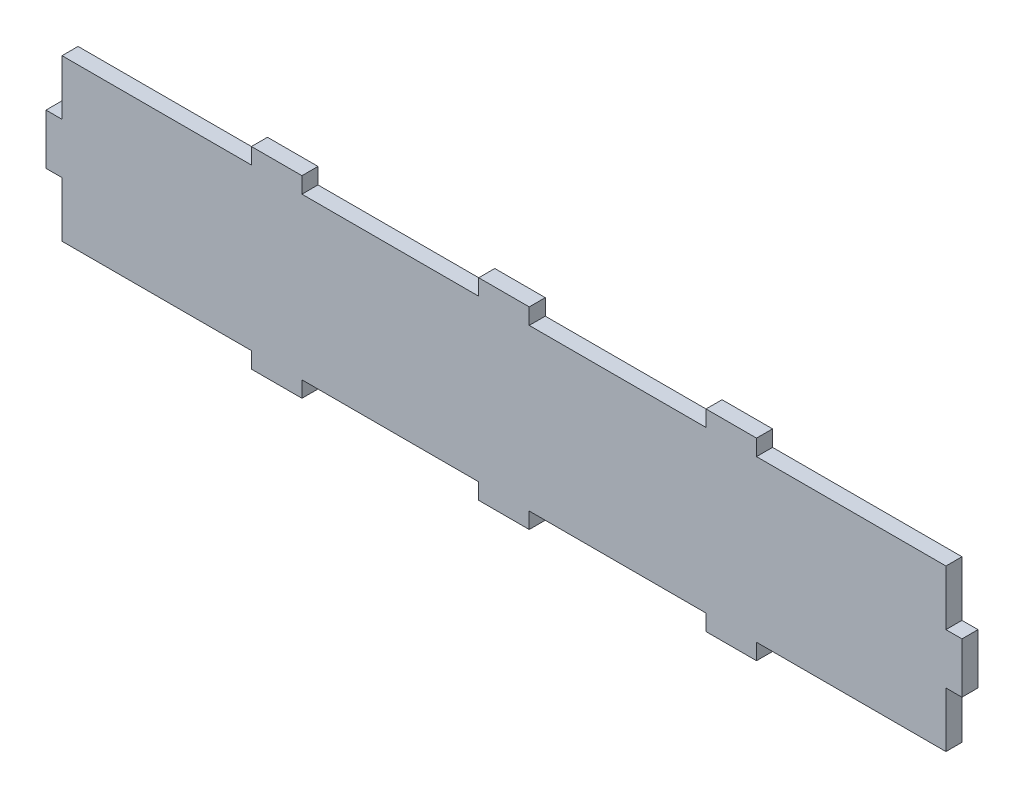
ISO-10303-21;
HEADER;
FILE_DESCRIPTION(('STEP AP214'),'2;1');
FILE_NAME('part.step','',(''),(''),'','','');
FILE_SCHEMA(('AUTOMOTIVE_DESIGN { 1 0 10303 214 1 1 1 1 }'));
ENDSEC;
DATA;
#1=APPLICATION_CONTEXT('core data for automotive mechanical design processes');
#2=APPLICATION_PROTOCOL_DEFINITION('international standard','automotive_design',2000,#1);
#3=PRODUCT_CONTEXT('',#1,'mechanical');
#4=PRODUCT('Part','Part','',(#3));
#5=PRODUCT_RELATED_PRODUCT_CATEGORY('part','',(#4));
#6=PRODUCT_DEFINITION_FORMATION('','',#4);
#7=PRODUCT_DEFINITION_CONTEXT('part definition',#1,'design');
#8=PRODUCT_DEFINITION('design','',#6,#7);
#9=PRODUCT_DEFINITION_SHAPE('','',#8);
#10=(LENGTH_UNIT() NAMED_UNIT(*) SI_UNIT(.MILLI.,.METRE.));
#11=(NAMED_UNIT(*) PLANE_ANGLE_UNIT() SI_UNIT($,.RADIAN.));
#12=(NAMED_UNIT(*) SI_UNIT($,.STERADIAN.) SOLID_ANGLE_UNIT());
#13=UNCERTAINTY_MEASURE_WITH_UNIT(LENGTH_MEASURE(1.E-05),#10,'distance_accuracy_value','');
#14=(GEOMETRIC_REPRESENTATION_CONTEXT(3) GLOBAL_UNCERTAINTY_ASSIGNED_CONTEXT((#13)) GLOBAL_UNIT_ASSIGNED_CONTEXT((#10,
#11,#12)) REPRESENTATION_CONTEXT('',''));
#15=CARTESIAN_POINT('',(0.,0.,0.));
#16=DIRECTION('',(0.,0.,1.));
#17=DIRECTION('',(1.,0.,0.));
#18=AXIS2_PLACEMENT_3D('',#15,#16,#17);
#19=CARTESIAN_POINT('',(193.650000026,6.34999999999999,6.35));
#20=DIRECTION('',(0.,1.,0.));
#21=DIRECTION('',(-1.,0.,0.));
#22=AXIS2_PLACEMENT_3D('',#19,#20,#21);
#23=PLANE('',#22);
#24=DIRECTION('',(1.,0.,0.));
#25=VECTOR('',#24,1.);
#26=CARTESIAN_POINT('',(193.650000026,6.34999999999999,6.35));
#27=LINE('',#26,#25);
#28=CARTESIAN_POINT('',(-61.349999974,6.35,6.35));
#29=VERTEX_POINT('',#28);
#30=CARTESIAN_POINT('',(8.65000002599997,6.35,6.35));
#31=VERTEX_POINT('',#30);
#32=EDGE_CURVE('E48',#29,#31,#27,.T.);
#33=ORIENTED_EDGE('',*,*,#32,.F.);
#34=DIRECTION('',(0.,0.,-1.));
#35=VECTOR('',#34,1.);
#36=CARTESIAN_POINT('',(-61.349999974,6.34999999999999,6.52347253575138E-13));
#37=LINE('',#36,#35);
#38=CARTESIAN_POINT('',(-61.349999974,6.34999999999999,6.52347253575138E-13));
#39=VERTEX_POINT('',#38);
#40=EDGE_CURVE('E274',#29,#39,#37,.T.);
#41=ORIENTED_EDGE('',*,*,#40,.T.);
#42=DIRECTION('',(1.,0.,0.));
#43=VECTOR('',#42,1.);
#44=CARTESIAN_POINT('',(193.650000026,6.34999999999999,0.));
#45=LINE('',#44,#43);
#46=CARTESIAN_POINT('',(8.65000002599998,6.34999999999999,0.));
#47=VERTEX_POINT('',#46);
#48=EDGE_CURVE('E527',#39,#47,#45,.T.);
#49=ORIENTED_EDGE('',*,*,#48,.T.);
#50=DIRECTION('',(0.,0.,1.));
#51=VECTOR('',#50,1.);
#52=CARTESIAN_POINT('',(8.65000002599998,6.34999999999999,0.));
#53=LINE('',#52,#51);
#54=EDGE_CURVE('E338',#47,#31,#53,.T.);
#55=ORIENTED_EDGE('',*,*,#54,.T.);
#56=EDGE_LOOP('',(#33,#41,#49,#55));
#57=FACE_BOUND('',#56,.T.);
#58=ADVANCED_FACE('F33',(#57),#23,.F.);
#59=CARTESIAN_POINT('',(118.650000026,6.35,6.35));
#60=VERTEX_POINT('',#59);
#61=CARTESIAN_POINT('',(193.650000026,6.34999999999999,6.35));
#62=VERTEX_POINT('',#61);
#63=EDGE_CURVE('E508',#60,#62,#27,.T.);
#64=ORIENTED_EDGE('',*,*,#63,.F.);
#65=DIRECTION('',(0.,0.,-1.));
#66=VECTOR('',#65,1.);
#67=CARTESIAN_POINT('',(118.650000026,6.34999999999999,0.));
#68=LINE('',#67,#66);
#69=CARTESIAN_POINT('',(118.650000026,6.34999999999999,0.));
#70=VERTEX_POINT('',#69);
#71=EDGE_CURVE('E277',#60,#70,#68,.T.);
#72=ORIENTED_EDGE('',*,*,#71,.T.);
#73=CARTESIAN_POINT('',(193.650000026,6.34999999999999,0.));
#74=VERTEX_POINT('',#73);
#75=EDGE_CURVE('E524',#70,#74,#45,.T.);
#76=ORIENTED_EDGE('',*,*,#75,.T.);
#77=DIRECTION('',(0.,0.,-1.));
#78=VECTOR('',#77,1.);
#79=CARTESIAN_POINT('',(193.650000026,6.34999999999999,6.35));
#80=LINE('',#79,#78);
#81=EDGE_CURVE('E511',#62,#74,#80,.T.);
#82=ORIENTED_EDGE('',*,*,#81,.F.);
#83=EDGE_LOOP('',(#64,#72,#76,#82));
#84=FACE_BOUND('',#83,.T.);
#85=ADVANCED_FACE('F601',(#84),#23,.F.);
#86=CARTESIAN_POINT('',(28.650000026,6.34999999999999,0.));
#87=VERTEX_POINT('',#86);
#88=CARTESIAN_POINT('',(98.650000026,6.35,0.));
#89=VERTEX_POINT('',#88);
#90=EDGE_CURVE('E528',#87,#89,#45,.T.);
#91=ORIENTED_EDGE('',*,*,#90,.T.);
#92=DIRECTION('',(0.,0.,1.));
#93=VECTOR('',#92,1.);
#94=CARTESIAN_POINT('',(98.650000026,6.34999999999999,0.));
#95=LINE('',#94,#93);
#96=CARTESIAN_POINT('',(98.650000026,6.35,6.35));
#97=VERTEX_POINT('',#96);
#98=EDGE_CURVE('E309',#89,#97,#95,.T.);
#99=ORIENTED_EDGE('',*,*,#98,.T.);
#100=CARTESIAN_POINT('',(28.650000026,6.34999999999999,6.34999999999999));
#101=VERTEX_POINT('',#100);
#102=EDGE_CURVE('E512',#101,#97,#27,.T.);
#103=ORIENTED_EDGE('',*,*,#102,.F.);
#104=DIRECTION('',(0.,0.,-1.));
#105=VECTOR('',#104,1.);
#106=CARTESIAN_POINT('',(28.650000026,6.34999999999999,0.));
#107=LINE('',#106,#105);
#108=EDGE_CURVE('E333',#101,#87,#107,.T.);
#109=ORIENTED_EDGE('',*,*,#108,.T.);
#110=EDGE_LOOP('',(#91,#99,#103,#109));
#111=FACE_BOUND('',#110,.T.);
#112=ADVANCED_FACE('F607',(#111),#23,.F.);
#113=CARTESIAN_POINT('',(193.650000026,70.,6.35));
#114=DIRECTION('',(0.,-1.,0.));
#115=DIRECTION('',(0.,0.,-1.));
#116=AXIS2_PLACEMENT_3D('',#113,#114,#115);
#117=PLANE('',#116);
#118=DIRECTION('',(0.,0.,-1.));
#119=VECTOR('',#118,1.);
#120=CARTESIAN_POINT('',(-61.349999974,70.,6.52347253575138E-13));
#121=LINE('',#120,#119);
#122=CARTESIAN_POINT('',(-61.349999974,70.,6.35));
#123=VERTEX_POINT('',#122);
#124=CARTESIAN_POINT('',(-61.349999974,70.,0.));
#125=VERTEX_POINT('',#124);
#126=EDGE_CURVE('E360',#123,#125,#121,.T.);
#127=ORIENTED_EDGE('',*,*,#126,.F.);
#128=DIRECTION('',(-1.,0.,0.));
#129=VECTOR('',#128,1.);
#130=CARTESIAN_POINT('',(193.650000026,70.,6.35));
#131=LINE('',#130,#129);
#132=CARTESIAN_POINT('',(8.65000002599998,70.,6.35));
#133=VERTEX_POINT('',#132);
#134=EDGE_CURVE('E504',#133,#123,#131,.T.);
#135=ORIENTED_EDGE('',*,*,#134,.F.);
#136=DIRECTION('',(0.,0.,1.));
#137=VECTOR('',#136,1.);
#138=CARTESIAN_POINT('',(8.65000002599998,70.,0.));
#139=LINE('',#138,#137);
#140=CARTESIAN_POINT('',(8.65000002599997,70.,0.));
#141=VERTEX_POINT('',#140);
#142=EDGE_CURVE('E419',#141,#133,#139,.T.);
#143=ORIENTED_EDGE('',*,*,#142,.F.);
#144=DIRECTION('',(-1.,0.,0.));
#145=VECTOR('',#144,1.);
#146=CARTESIAN_POINT('',(193.650000026,70.,0.));
#147=LINE('',#146,#145);
#148=EDGE_CURVE('E521',#141,#125,#147,.T.);
#149=ORIENTED_EDGE('',*,*,#148,.T.);
#150=EDGE_LOOP('',(#127,#135,#143,#149));
#151=FACE_BOUND('',#150,.T.);
#152=ADVANCED_FACE('F578',(#151),#117,.F.);
#153=DIRECTION('',(0.,0.,1.));
#154=VECTOR('',#153,1.);
#155=CARTESIAN_POINT('',(-81.349999974,70.,6.59695134370022E-13));
#156=LINE('',#155,#154);
#157=CARTESIAN_POINT('',(-81.349999974,70.,6.59695134370022E-13));
#158=VERTEX_POINT('',#157);
#159=CARTESIAN_POINT('',(-81.349999974,70.,6.35));
#160=VERTEX_POINT('',#159);
#161=EDGE_CURVE('E365',#158,#160,#156,.T.);
#162=ORIENTED_EDGE('',*,*,#161,.F.);
#163=CARTESIAN_POINT('',(-156.349999974,70.,0.));
#164=VERTEX_POINT('',#163);
#165=EDGE_CURVE('E516',#158,#164,#147,.T.);
#166=ORIENTED_EDGE('',*,*,#165,.T.);
#167=DIRECTION('',(0.,0.,-1.));
#168=VECTOR('',#167,1.);
#169=CARTESIAN_POINT('',(-156.349999974,70.,6.35));
#170=LINE('',#169,#168);
#171=CARTESIAN_POINT('',(-156.349999974,70.,6.35));
#172=VERTEX_POINT('',#171);
#173=EDGE_CURVE('E41',#172,#164,#170,.T.);
#174=ORIENTED_EDGE('',*,*,#173,.F.);
#175=EDGE_CURVE('E497',#160,#172,#131,.T.);
#176=ORIENTED_EDGE('',*,*,#175,.F.);
#177=EDGE_LOOP('',(#162,#166,#174,#176));
#178=FACE_BOUND('',#177,.T.);
#179=ADVANCED_FACE('F580',(#178),#117,.F.);
#180=DIRECTION('',(0.,0.,-1.));
#181=VECTOR('',#180,1.);
#182=CARTESIAN_POINT('',(118.650000026,70.,0.));
#183=LINE('',#182,#181);
#184=CARTESIAN_POINT('',(118.650000026,70.,6.35));
#185=VERTEX_POINT('',#184);
#186=CARTESIAN_POINT('',(118.650000026,70.,0.));
#187=VERTEX_POINT('',#186);
#188=EDGE_CURVE('E387',#185,#187,#183,.T.);
#189=ORIENTED_EDGE('',*,*,#188,.F.);
#190=CARTESIAN_POINT('',(193.650000026,70.,6.35));
#191=VERTEX_POINT('',#190);
#192=EDGE_CURVE('E499',#191,#185,#131,.T.);
#193=ORIENTED_EDGE('',*,*,#192,.F.);
#194=DIRECTION('',(0.,0.,-1.));
#195=VECTOR('',#194,1.);
#196=CARTESIAN_POINT('',(193.650000026,70.,6.35));
#197=LINE('',#196,#195);
#198=CARTESIAN_POINT('',(193.650000026,70.,0.));
#199=VERTEX_POINT('',#198);
#200=EDGE_CURVE('E11',#191,#199,#197,.T.);
#201=ORIENTED_EDGE('',*,*,#200,.T.);
#202=EDGE_CURVE('E517',#199,#187,#147,.T.);
#203=ORIENTED_EDGE('',*,*,#202,.T.);
#204=EDGE_LOOP('',(#189,#193,#201,#203));
#205=FACE_BOUND('',#204,.T.);
#206=ADVANCED_FACE('F625',(#205),#117,.F.);
#207=DIRECTION('',(0.,0.,1.));
#208=VECTOR('',#207,1.);
#209=CARTESIAN_POINT('',(98.650000026,70.,0.));
#210=LINE('',#209,#208);
#211=CARTESIAN_POINT('',(98.650000026,70.,0.));
#212=VERTEX_POINT('',#211);
#213=CARTESIAN_POINT('',(98.650000026,70.,6.35));
#214=VERTEX_POINT('',#213);
#215=EDGE_CURVE('E392',#212,#214,#210,.T.);
#216=ORIENTED_EDGE('',*,*,#215,.F.);
#217=CARTESIAN_POINT('',(28.650000026,70.,0.));
#218=VERTEX_POINT('',#217);
#219=EDGE_CURVE('E520',#212,#218,#147,.T.);
#220=ORIENTED_EDGE('',*,*,#219,.T.);
#221=DIRECTION('',(0.,0.,-1.));
#222=VECTOR('',#221,1.);
#223=CARTESIAN_POINT('',(28.650000026,70.,0.));
#224=LINE('',#223,#222);
#225=CARTESIAN_POINT('',(28.650000026,70.,6.35));
#226=VERTEX_POINT('',#225);
#227=EDGE_CURVE('E414',#226,#218,#224,.T.);
#228=ORIENTED_EDGE('',*,*,#227,.F.);
#229=EDGE_CURVE('E503',#214,#226,#131,.T.);
#230=ORIENTED_EDGE('',*,*,#229,.F.);
#231=EDGE_LOOP('',(#216,#220,#228,#230));
#232=FACE_BOUND('',#231,.T.);
#233=ADVANCED_FACE('F564',(#232),#117,.F.);
#234=CARTESIAN_POINT('',(193.650000026,6.34999999999999,6.35));
#235=DIRECTION('',(-1.,0.,0.));
#236=DIRECTION('',(0.,0.,1.));
#237=AXIS2_PLACEMENT_3D('',#234,#235,#236);
#238=PLANE('',#237);
#239=DIRECTION('',(0.,1.,0.));
#240=VECTOR('',#239,1.);
#241=CARTESIAN_POINT('',(193.650000026,6.34999999999999,0.));
#242=LINE('',#241,#240);
#243=CARTESIAN_POINT('',(193.650000026,28.175,0.));
#244=VERTEX_POINT('',#243);
#245=EDGE_CURVE('E513',#74,#244,#242,.T.);
#246=ORIENTED_EDGE('',*,*,#245,.T.);
#247=DIRECTION('',(0.,0.,1.));
#248=VECTOR('',#247,1.);
#249=CARTESIAN_POINT('',(193.650000026,28.175,0.));
#250=LINE('',#249,#248);
#251=CARTESIAN_POINT('',(193.650000026,28.175,6.35));
#252=VERTEX_POINT('',#251);
#253=EDGE_CURVE('E446',#244,#252,#250,.T.);
#254=ORIENTED_EDGE('',*,*,#253,.T.);
#255=DIRECTION('',(0.,1.,0.));
#256=VECTOR('',#255,1.);
#257=CARTESIAN_POINT('',(193.650000026,6.34999999999999,6.35));
#258=LINE('',#257,#256);
#259=EDGE_CURVE('E495',#62,#252,#258,.T.);
#260=ORIENTED_EDGE('',*,*,#259,.F.);
#261=ORIENTED_EDGE('',*,*,#81,.T.);
#262=EDGE_LOOP('',(#246,#254,#260,#261));
#263=FACE_BOUND('',#262,.T.);
#264=ADVANCED_FACE('F619',(#263),#238,.F.);
#265=CARTESIAN_POINT('',(-156.349999974,6.35,6.35));
#266=DIRECTION('',(1.,0.,0.));
#267=DIRECTION('',(0.,0.,-1.));
#268=AXIS2_PLACEMENT_3D('',#265,#266,#267);
#269=PLANE('',#268);
#270=DIRECTION('',(0.,0.,-1.));
#271=VECTOR('',#270,1.);
#272=CARTESIAN_POINT('',(-156.349999974,48.175,0.));
#273=LINE('',#272,#271);
#274=CARTESIAN_POINT('',(-156.349999974,48.175,6.35));
#275=VERTEX_POINT('',#274);
#276=CARTESIAN_POINT('',(-156.349999974,48.175,0.));
#277=VERTEX_POINT('',#276);
#278=EDGE_CURVE('E472',#275,#277,#273,.T.);
#279=ORIENTED_EDGE('',*,*,#278,.F.);
#280=DIRECTION('',(0.,-1.,0.));
#281=VECTOR('',#280,1.);
#282=CARTESIAN_POINT('',(-156.349999974,6.35,6.35));
#283=LINE('',#282,#281);
#284=EDGE_CURVE('E505',#172,#275,#283,.T.);
#285=ORIENTED_EDGE('',*,*,#284,.F.);
#286=ORIENTED_EDGE('',*,*,#173,.T.);
#287=DIRECTION('',(0.,-1.,0.));
#288=VECTOR('',#287,1.);
#289=CARTESIAN_POINT('',(-156.349999974,6.35,0.));
#290=LINE('',#289,#288);
#291=EDGE_CURVE('E522',#164,#277,#290,.T.);
#292=ORIENTED_EDGE('',*,*,#291,.T.);
#293=EDGE_LOOP('',(#279,#285,#286,#292));
#294=FACE_BOUND('',#293,.T.);
#295=ADVANCED_FACE('F538',(#294),#269,.F.);
#296=DIRECTION('',(0.,0.,1.));
#297=VECTOR('',#296,1.);
#298=CARTESIAN_POINT('',(-156.349999974,28.175,0.));
#299=LINE('',#298,#297);
#300=CARTESIAN_POINT('',(-156.349999974,28.175,0.));
#301=VERTEX_POINT('',#300);
#302=CARTESIAN_POINT('',(-156.349999974,28.175,6.35));
#303=VERTEX_POINT('',#302);
#304=EDGE_CURVE('E467',#301,#303,#299,.T.);
#305=ORIENTED_EDGE('',*,*,#304,.F.);
#306=CARTESIAN_POINT('',(-156.349999974,6.35,0.));
#307=VERTEX_POINT('',#306);
#308=EDGE_CURVE('E519',#301,#307,#290,.T.);
#309=ORIENTED_EDGE('',*,*,#308,.T.);
#310=DIRECTION('',(0.,0.,-1.));
#311=VECTOR('',#310,1.);
#312=CARTESIAN_POINT('',(-156.349999974,6.35,6.35));
#313=LINE('',#312,#311);
#314=CARTESIAN_POINT('',(-156.349999974,6.35,6.35));
#315=VERTEX_POINT('',#314);
#316=EDGE_CURVE('E531',#315,#307,#313,.T.);
#317=ORIENTED_EDGE('',*,*,#316,.F.);
#318=EDGE_CURVE('E502',#303,#315,#283,.T.);
#319=ORIENTED_EDGE('',*,*,#318,.F.);
#320=EDGE_LOOP('',(#305,#309,#317,#319));
#321=FACE_BOUND('',#320,.T.);
#322=ADVANCED_FACE('F617',(#321),#269,.F.);
#323=CARTESIAN_POINT('',(193.650000026,48.175,6.34999999999999));
#324=VERTEX_POINT('',#323);
#325=EDGE_CURVE('E498',#324,#191,#258,.T.);
#326=ORIENTED_EDGE('',*,*,#325,.F.);
#327=DIRECTION('',(0.,0.,-1.));
#328=VECTOR('',#327,1.);
#329=CARTESIAN_POINT('',(193.650000026,48.175,0.));
#330=LINE('',#329,#328);
#331=CARTESIAN_POINT('',(193.650000026,48.175,0.));
#332=VERTEX_POINT('',#331);
#333=EDGE_CURVE('E441',#324,#332,#330,.T.);
#334=ORIENTED_EDGE('',*,*,#333,.T.);
#335=EDGE_CURVE('E494',#332,#199,#242,.T.);
#336=ORIENTED_EDGE('',*,*,#335,.T.);
#337=ORIENTED_EDGE('',*,*,#200,.F.);
#338=EDGE_LOOP('',(#326,#334,#336,#337));
#339=FACE_BOUND('',#338,.T.);
#340=ADVANCED_FACE('F35',(#339),#238,.F.);
#341=CARTESIAN_POINT('',(-81.349999974,6.35,0.));
#342=VERTEX_POINT('',#341);
#343=EDGE_CURVE('E525',#307,#342,#45,.T.);
#344=ORIENTED_EDGE('',*,*,#343,.T.);
#345=DIRECTION('',(0.,0.,1.));
#346=VECTOR('',#345,1.);
#347=CARTESIAN_POINT('',(-81.349999974,6.34999999999999,6.59695134370022E-13));
#348=LINE('',#347,#346);
#349=CARTESIAN_POINT('',(-81.349999974,6.35,6.35));
#350=VERTEX_POINT('',#349);
#351=EDGE_CURVE('E56',#342,#350,#348,.T.);
#352=ORIENTED_EDGE('',*,*,#351,.T.);
#353=EDGE_CURVE('E509',#315,#350,#27,.T.);
#354=ORIENTED_EDGE('',*,*,#353,.F.);
#355=ORIENTED_EDGE('',*,*,#316,.T.);
#356=EDGE_LOOP('',(#344,#352,#354,#355));
#357=FACE_BOUND('',#356,.T.);
#358=ADVANCED_FACE('F603',(#357),#23,.F.);
#359=CARTESIAN_POINT('',(0.,0.,6.35));
#360=DIRECTION('',(0.,0.,1.));
#361=DIRECTION('',(1.,0.,0.));
#362=AXIS2_PLACEMENT_3D('',#359,#360,#361);
#363=PLANE('',#362);
#364=ORIENTED_EDGE('',*,*,#259,.T.);
#365=DIRECTION('',(-1.,0.,0.));
#366=VECTOR('',#365,1.);
#367=CARTESIAN_POINT('',(200.000000026,28.175,6.35));
#368=LINE('',#367,#366);
#369=CARTESIAN_POINT('',(200.000000026,28.175,6.35));
#370=VERTEX_POINT('',#369);
#371=EDGE_CURVE('E461',#370,#252,#368,.T.);
#372=ORIENTED_EDGE('',*,*,#371,.F.);
#373=DIRECTION('',(0.,1.,0.));
#374=VECTOR('',#373,1.);
#375=CARTESIAN_POINT('',(200.000000026,48.175,6.34999999999999));
#376=LINE('',#375,#374);
#377=CARTESIAN_POINT('',(200.000000026,48.175,6.34999999999999));
#378=VERTEX_POINT('',#377);
#379=EDGE_CURVE('E449',#370,#378,#376,.T.);
#380=ORIENTED_EDGE('',*,*,#379,.T.);
#381=DIRECTION('',(-1.,0.,0.));
#382=VECTOR('',#381,1.);
#383=CARTESIAN_POINT('',(200.000000026,48.175,6.34999999999999));
#384=LINE('',#383,#382);
#385=EDGE_CURVE('E463',#378,#324,#384,.T.);
#386=ORIENTED_EDGE('',*,*,#385,.T.);
#387=ORIENTED_EDGE('',*,*,#325,.T.);
#388=ORIENTED_EDGE('',*,*,#192,.T.);
#389=DIRECTION('',(0.,-1.,0.));
#390=VECTOR('',#389,1.);
#391=CARTESIAN_POINT('',(118.650000026,76.35,6.34999999999999));
#392=LINE('',#391,#390);
#393=CARTESIAN_POINT('',(118.650000026,76.35,6.34999999999999));
#394=VERTEX_POINT('',#393);
#395=EDGE_CURVE('E398',#394,#185,#392,.T.);
#396=ORIENTED_EDGE('',*,*,#395,.F.);
#397=DIRECTION('',(1.,0.,0.));
#398=VECTOR('',#397,1.);
#399=CARTESIAN_POINT('',(118.650000026,76.35,6.34999999999999));
#400=LINE('',#399,#398);
#401=CARTESIAN_POINT('',(98.650000026,76.35,6.35));
#402=VERTEX_POINT('',#401);
#403=EDGE_CURVE('E396',#402,#394,#400,.T.);
#404=ORIENTED_EDGE('',*,*,#403,.F.);
#405=DIRECTION('',(0.,-1.,0.));
#406=VECTOR('',#405,1.);
#407=CARTESIAN_POINT('',(98.650000026,76.35,6.35));
#408=LINE('',#407,#406);
#409=EDGE_CURVE('E405',#402,#214,#408,.T.);
#410=ORIENTED_EDGE('',*,*,#409,.T.);
#411=ORIENTED_EDGE('',*,*,#229,.T.);
#412=DIRECTION('',(0.,-1.,0.));
#413=VECTOR('',#412,1.);
#414=CARTESIAN_POINT('',(28.650000026,76.35,6.34999999999999));
#415=LINE('',#414,#413);
#416=CARTESIAN_POINT('',(28.650000026,76.35,6.34999999999999));
#417=VERTEX_POINT('',#416);
#418=EDGE_CURVE('E425',#417,#226,#415,.T.);
#419=ORIENTED_EDGE('',*,*,#418,.F.);
#420=DIRECTION('',(1.,0.,0.));
#421=VECTOR('',#420,1.);
#422=CARTESIAN_POINT('',(28.650000026,76.35,6.34999999999999));
#423=LINE('',#422,#421);
#424=CARTESIAN_POINT('',(8.65000002599998,76.35,6.35));
#425=VERTEX_POINT('',#424);
#426=EDGE_CURVE('E423',#425,#417,#423,.T.);
#427=ORIENTED_EDGE('',*,*,#426,.F.);
#428=DIRECTION('',(0.,-1.,0.));
#429=VECTOR('',#428,1.);
#430=CARTESIAN_POINT('',(8.65000002599998,76.35,6.35));
#431=LINE('',#430,#429);
#432=EDGE_CURVE('E432',#425,#133,#431,.T.);
#433=ORIENTED_EDGE('',*,*,#432,.T.);
#434=ORIENTED_EDGE('',*,*,#134,.T.);
#435=DIRECTION('',(0.,-1.,0.));
#436=VECTOR('',#435,1.);
#437=CARTESIAN_POINT('',(-61.349999974,76.35,6.35000000000062));
#438=LINE('',#437,#436);
#439=CARTESIAN_POINT('',(-61.349999974,76.35,6.35000000000062));
#440=VERTEX_POINT('',#439);
#441=EDGE_CURVE('E371',#440,#123,#438,.T.);
#442=ORIENTED_EDGE('',*,*,#441,.F.);
#443=DIRECTION('',(1.,0.,0.));
#444=VECTOR('',#443,1.);
#445=CARTESIAN_POINT('',(-61.349999974,76.35,6.35000000000062));
#446=LINE('',#445,#444);
#447=CARTESIAN_POINT('',(-81.349999974,76.35,6.35000000000063));
#448=VERTEX_POINT('',#447);
#449=EDGE_CURVE('E369',#448,#440,#446,.T.);
#450=ORIENTED_EDGE('',*,*,#449,.F.);
#451=DIRECTION('',(0.,-1.,0.));
#452=VECTOR('',#451,1.);
#453=CARTESIAN_POINT('',(-81.349999974,76.35,6.35000000000063));
#454=LINE('',#453,#452);
#455=EDGE_CURVE('E378',#448,#160,#454,.T.);
#456=ORIENTED_EDGE('',*,*,#455,.T.);
#457=ORIENTED_EDGE('',*,*,#175,.T.);
#458=ORIENTED_EDGE('',*,*,#284,.T.);
#459=DIRECTION('',(1.,0.,0.));
#460=VECTOR('',#459,1.);
#461=CARTESIAN_POINT('',(-162.699999974,48.175,6.34999999999999));
#462=LINE('',#461,#460);
#463=CARTESIAN_POINT('',(-162.699999974,48.175,6.34999999999999));
#464=VERTEX_POINT('',#463);
#465=EDGE_CURVE('E485',#464,#275,#462,.T.);
#466=ORIENTED_EDGE('',*,*,#465,.F.);
#467=DIRECTION('',(0.,1.,0.));
#468=VECTOR('',#467,1.);
#469=CARTESIAN_POINT('',(-162.699999974,48.175,6.34999999999999));
#470=LINE('',#469,#468);
#471=CARTESIAN_POINT('',(-162.699999974,28.175,6.35));
#472=VERTEX_POINT('',#471);
#473=EDGE_CURVE('E474',#472,#464,#470,.T.);
#474=ORIENTED_EDGE('',*,*,#473,.F.);
#475=DIRECTION('',(1.,0.,0.));
#476=VECTOR('',#475,1.);
#477=CARTESIAN_POINT('',(-162.699999974,28.175,6.35));
#478=LINE('',#477,#476);
#479=EDGE_CURVE('E488',#472,#303,#478,.T.);
#480=ORIENTED_EDGE('',*,*,#479,.T.);
#481=ORIENTED_EDGE('',*,*,#318,.T.);
#482=ORIENTED_EDGE('',*,*,#353,.T.);
#483=DIRECTION('',(0.,1.,0.));
#484=VECTOR('',#483,1.);
#485=CARTESIAN_POINT('',(-81.349999974,0.,6.35000000000063));
#486=LINE('',#485,#484);
#487=CARTESIAN_POINT('',(-81.349999974,0.,6.35000000000063));
#488=VERTEX_POINT('',#487);
#489=EDGE_CURVE('E278',#488,#350,#486,.T.);
#490=ORIENTED_EDGE('',*,*,#489,.F.);
#491=DIRECTION('',(1.,0.,0.));
#492=VECTOR('',#491,1.);
#493=CARTESIAN_POINT('',(-61.349999974,0.,6.35000000000062));
#494=LINE('',#493,#492);
#495=CARTESIAN_POINT('',(-61.349999974,0.,6.35000000000062));
#496=VERTEX_POINT('',#495);
#497=EDGE_CURVE('E284',#488,#496,#494,.T.);
#498=ORIENTED_EDGE('',*,*,#497,.T.);
#499=DIRECTION('',(0.,1.,0.));
#500=VECTOR('',#499,1.);
#501=CARTESIAN_POINT('',(-61.349999974,0.,6.35000000000062));
#502=LINE('',#501,#500);
#503=EDGE_CURVE('E268',#496,#29,#502,.T.);
#504=ORIENTED_EDGE('',*,*,#503,.T.);
#505=ORIENTED_EDGE('',*,*,#32,.T.);
#506=DIRECTION('',(0.,1.,0.));
#507=VECTOR('',#506,1.);
#508=CARTESIAN_POINT('',(8.65000002599998,0.,6.35));
#509=LINE('',#508,#507);
#510=CARTESIAN_POINT('',(8.65000002599998,0.,6.35));
#511=VERTEX_POINT('',#510);
#512=EDGE_CURVE('E355',#511,#31,#509,.T.);
#513=ORIENTED_EDGE('',*,*,#512,.F.);
#514=DIRECTION('',(1.,0.,0.));
#515=VECTOR('',#514,1.);
#516=CARTESIAN_POINT('',(28.650000026,0.,6.34999999999999));
#517=LINE('',#516,#515);
#518=CARTESIAN_POINT('',(28.650000026,0.,6.34999999999999));
#519=VERTEX_POINT('',#518);
#520=EDGE_CURVE('E337',#511,#519,#517,.T.);
#521=ORIENTED_EDGE('',*,*,#520,.T.);
#522=DIRECTION('',(0.,1.,0.));
#523=VECTOR('',#522,1.);
#524=CARTESIAN_POINT('',(28.650000026,0.,6.34999999999999));
#525=LINE('',#524,#523);
#526=EDGE_CURVE('E358',#519,#101,#525,.T.);
#527=ORIENTED_EDGE('',*,*,#526,.T.);
#528=ORIENTED_EDGE('',*,*,#102,.T.);
#529=DIRECTION('',(0.,1.,0.));
#530=VECTOR('',#529,1.);
#531=CARTESIAN_POINT('',(98.650000026,0.,6.35));
#532=LINE('',#531,#530);
#533=CARTESIAN_POINT('',(98.650000026,0.,6.35));
#534=VERTEX_POINT('',#533);
#535=EDGE_CURVE('E327',#534,#97,#532,.T.);
#536=ORIENTED_EDGE('',*,*,#535,.F.);
#537=DIRECTION('',(1.,0.,0.));
#538=VECTOR('',#537,1.);
#539=CARTESIAN_POINT('',(118.650000026,0.,6.34999999999999));
#540=LINE('',#539,#538);
#541=CARTESIAN_POINT('',(118.650000026,0.,6.34999999999999));
#542=VERTEX_POINT('',#541);
#543=EDGE_CURVE('E308',#534,#542,#540,.T.);
#544=ORIENTED_EDGE('',*,*,#543,.T.);
#545=DIRECTION('',(0.,1.,0.));
#546=VECTOR('',#545,1.);
#547=CARTESIAN_POINT('',(118.650000026,0.,6.34999999999999));
#548=LINE('',#547,#546);
#549=EDGE_CURVE('E330',#542,#60,#548,.T.);
#550=ORIENTED_EDGE('',*,*,#549,.T.);
#551=ORIENTED_EDGE('',*,*,#63,.T.);
#552=EDGE_LOOP('',(#364,#372,#380,#386,#387,#388,#396,#404,#410,#411,#419,#427,#433,#434,#442,
#450,#456,#457,#458,#466,#474,#480,#481,#482,#490,#498,#504,#505,#513,#521,#527,#528,#536,#544,
#550,#551));
#553=FACE_BOUND('',#552,.T.);
#554=ADVANCED_FACE('F290',(#553),#363,.T.);
#555=CARTESIAN_POINT('',(0.,0.,0.));
#556=DIRECTION('',(0.,0.,1.));
#557=DIRECTION('',(1.,0.,0.));
#558=AXIS2_PLACEMENT_3D('',#555,#556,#557);
#559=PLANE('',#558);
#560=ORIENTED_EDGE('',*,*,#245,.F.);
#561=ORIENTED_EDGE('',*,*,#75,.F.);
#562=DIRECTION('',(0.,1.,0.));
#563=VECTOR('',#562,1.);
#564=CARTESIAN_POINT('',(118.650000026,0.,0.));
#565=LINE('',#564,#563);
#566=CARTESIAN_POINT('',(118.650000026,0.,0.));
#567=VERTEX_POINT('',#566);
#568=EDGE_CURVE('E318',#567,#70,#565,.T.);
#569=ORIENTED_EDGE('',*,*,#568,.F.);
#570=DIRECTION('',(-1.,0.,0.));
#571=VECTOR('',#570,1.);
#572=CARTESIAN_POINT('',(118.650000026,0.,0.));
#573=LINE('',#572,#571);
#574=CARTESIAN_POINT('',(98.650000026,0.,0.));
#575=VERTEX_POINT('',#574);
#576=EDGE_CURVE('E315',#567,#575,#573,.T.);
#577=ORIENTED_EDGE('',*,*,#576,.T.);
#578=DIRECTION('',(0.,1.,0.));
#579=VECTOR('',#578,1.);
#580=CARTESIAN_POINT('',(98.650000026,0.,0.));
#581=LINE('',#580,#579);
#582=EDGE_CURVE('E324',#575,#89,#581,.T.);
#583=ORIENTED_EDGE('',*,*,#582,.T.);
#584=ORIENTED_EDGE('',*,*,#90,.F.);
#585=DIRECTION('',(0.,1.,0.));
#586=VECTOR('',#585,1.);
#587=CARTESIAN_POINT('',(28.650000026,0.,0.));
#588=LINE('',#587,#586);
#589=CARTESIAN_POINT('',(28.650000026,0.,0.));
#590=VERTEX_POINT('',#589);
#591=EDGE_CURVE('E347',#590,#87,#588,.T.);
#592=ORIENTED_EDGE('',*,*,#591,.F.);
#593=DIRECTION('',(-1.,0.,0.));
#594=VECTOR('',#593,1.);
#595=CARTESIAN_POINT('',(28.650000026,0.,0.));
#596=LINE('',#595,#594);
#597=CARTESIAN_POINT('',(8.65000002599998,0.,0.));
#598=VERTEX_POINT('',#597);
#599=EDGE_CURVE('E344',#590,#598,#596,.T.);
#600=ORIENTED_EDGE('',*,*,#599,.T.);
#601=DIRECTION('',(0.,1.,0.));
#602=VECTOR('',#601,1.);
#603=CARTESIAN_POINT('',(8.65000002599998,0.,0.));
#604=LINE('',#603,#602);
#605=EDGE_CURVE('E352',#598,#47,#604,.T.);
#606=ORIENTED_EDGE('',*,*,#605,.T.);
#607=ORIENTED_EDGE('',*,*,#48,.F.);
#608=DIRECTION('',(0.,1.,0.));
#609=VECTOR('',#608,1.);
#610=CARTESIAN_POINT('',(-61.349999974,0.,6.52347253575138E-13));
#611=LINE('',#610,#609);
#612=CARTESIAN_POINT('',(-61.349999974,0.,6.52347253575138E-13));
#613=VERTEX_POINT('',#612);
#614=EDGE_CURVE('E297',#613,#39,#611,.T.);
#615=ORIENTED_EDGE('',*,*,#614,.F.);
#616=DIRECTION('',(-1.,0.,0.));
#617=VECTOR('',#616,1.);
#618=CARTESIAN_POINT('',(-61.349999974,0.,6.52347253575138E-13));
#619=LINE('',#618,#617);
#620=CARTESIAN_POINT('',(-81.349999974,0.,6.59695134370022E-13));
#621=VERTEX_POINT('',#620);
#622=EDGE_CURVE('E287',#613,#621,#619,.T.);
#623=ORIENTED_EDGE('',*,*,#622,.T.);
#624=DIRECTION('',(0.,1.,0.));
#625=VECTOR('',#624,1.);
#626=CARTESIAN_POINT('',(-81.349999974,0.,6.59695134370022E-13));
#627=LINE('',#626,#625);
#628=EDGE_CURVE('E301',#621,#342,#627,.T.);
#629=ORIENTED_EDGE('',*,*,#628,.T.);
#630=ORIENTED_EDGE('',*,*,#343,.F.);
#631=ORIENTED_EDGE('',*,*,#308,.F.);
#632=DIRECTION('',(1.,0.,0.));
#633=VECTOR('',#632,1.);
#634=CARTESIAN_POINT('',(-162.699999974,28.175,0.));
#635=LINE('',#634,#633);
#636=CARTESIAN_POINT('',(-162.699999974,28.175,0.));
#637=VERTEX_POINT('',#636);
#638=EDGE_CURVE('E491',#637,#301,#635,.T.);
#639=ORIENTED_EDGE('',*,*,#638,.F.);
#640=DIRECTION('',(0.,-1.,0.));
#641=VECTOR('',#640,1.);
#642=CARTESIAN_POINT('',(-162.699999974,48.175,0.));
#643=LINE('',#642,#641);
#644=CARTESIAN_POINT('',(-162.699999974,48.175,0.));
#645=VERTEX_POINT('',#644);
#646=EDGE_CURVE('E468',#645,#637,#643,.T.);
#647=ORIENTED_EDGE('',*,*,#646,.F.);
#648=DIRECTION('',(1.,0.,0.));
#649=VECTOR('',#648,1.);
#650=CARTESIAN_POINT('',(-162.699999974,48.175,0.));
#651=LINE('',#650,#649);
#652=EDGE_CURVE('E478',#645,#277,#651,.T.);
#653=ORIENTED_EDGE('',*,*,#652,.T.);
#654=ORIENTED_EDGE('',*,*,#291,.F.);
#655=ORIENTED_EDGE('',*,*,#165,.F.);
#656=DIRECTION('',(0.,-1.,0.));
#657=VECTOR('',#656,1.);
#658=CARTESIAN_POINT('',(-81.349999974,76.35,6.59695134370022E-13));
#659=LINE('',#658,#657);
#660=CARTESIAN_POINT('',(-81.349999974,76.35,6.59695134370022E-13));
#661=VERTEX_POINT('',#660);
#662=EDGE_CURVE('E381',#661,#158,#659,.T.);
#663=ORIENTED_EDGE('',*,*,#662,.F.);
#664=DIRECTION('',(-1.,0.,0.));
#665=VECTOR('',#664,1.);
#666=CARTESIAN_POINT('',(-61.349999974,76.35,6.52347253575138E-13));
#667=LINE('',#666,#665);
#668=CARTESIAN_POINT('',(-61.349999974,76.35,6.52347253575138E-13));
#669=VERTEX_POINT('',#668);
#670=EDGE_CURVE('E364',#669,#661,#667,.T.);
#671=ORIENTED_EDGE('',*,*,#670,.F.);
#672=DIRECTION('',(0.,-1.,0.));
#673=VECTOR('',#672,1.);
#674=CARTESIAN_POINT('',(-61.349999974,76.35,6.52347253575138E-13));
#675=LINE('',#674,#673);
#676=EDGE_CURVE('E384',#669,#125,#675,.T.);
#677=ORIENTED_EDGE('',*,*,#676,.T.);
#678=ORIENTED_EDGE('',*,*,#148,.F.);
#679=DIRECTION('',(0.,-1.,0.));
#680=VECTOR('',#679,1.);
#681=CARTESIAN_POINT('',(8.65000002599998,76.35,0.));
#682=LINE('',#681,#680);
#683=CARTESIAN_POINT('',(8.65000002599998,76.35,0.));
#684=VERTEX_POINT('',#683);
#685=EDGE_CURVE('E435',#684,#141,#682,.T.);
#686=ORIENTED_EDGE('',*,*,#685,.F.);
#687=DIRECTION('',(-1.,0.,0.));
#688=VECTOR('',#687,1.);
#689=CARTESIAN_POINT('',(28.650000026,76.35,0.));
#690=LINE('',#689,#688);
#691=CARTESIAN_POINT('',(28.650000026,76.35,0.));
#692=VERTEX_POINT('',#691);
#693=EDGE_CURVE('E418',#692,#684,#690,.T.);
#694=ORIENTED_EDGE('',*,*,#693,.F.);
#695=DIRECTION('',(0.,-1.,0.));
#696=VECTOR('',#695,1.);
#697=CARTESIAN_POINT('',(28.650000026,76.35,0.));
#698=LINE('',#697,#696);
#699=EDGE_CURVE('E438',#692,#218,#698,.T.);
#700=ORIENTED_EDGE('',*,*,#699,.T.);
#701=ORIENTED_EDGE('',*,*,#219,.F.);
#702=DIRECTION('',(0.,-1.,0.));
#703=VECTOR('',#702,1.);
#704=CARTESIAN_POINT('',(98.650000026,76.35,0.));
#705=LINE('',#704,#703);
#706=CARTESIAN_POINT('',(98.650000026,76.35,0.));
#707=VERTEX_POINT('',#706);
#708=EDGE_CURVE('E408',#707,#212,#705,.T.);
#709=ORIENTED_EDGE('',*,*,#708,.F.);
#710=DIRECTION('',(-1.,0.,0.));
#711=VECTOR('',#710,1.);
#712=CARTESIAN_POINT('',(118.650000026,76.35,0.));
#713=LINE('',#712,#711);
#714=CARTESIAN_POINT('',(118.650000026,76.35,0.));
#715=VERTEX_POINT('',#714);
#716=EDGE_CURVE('E391',#715,#707,#713,.T.);
#717=ORIENTED_EDGE('',*,*,#716,.F.);
#718=DIRECTION('',(0.,-1.,0.));
#719=VECTOR('',#718,1.);
#720=CARTESIAN_POINT('',(118.650000026,76.35,0.));
#721=LINE('',#720,#719);
#722=EDGE_CURVE('E411',#715,#187,#721,.T.);
#723=ORIENTED_EDGE('',*,*,#722,.T.);
#724=ORIENTED_EDGE('',*,*,#202,.F.);
#725=ORIENTED_EDGE('',*,*,#335,.F.);
#726=DIRECTION('',(-1.,0.,0.));
#727=VECTOR('',#726,1.);
#728=CARTESIAN_POINT('',(200.000000026,48.175,0.));
#729=LINE('',#728,#727);
#730=CARTESIAN_POINT('',(200.000000026,48.175,0.));
#731=VERTEX_POINT('',#730);
#732=EDGE_CURVE('E465',#731,#332,#729,.T.);
#733=ORIENTED_EDGE('',*,*,#732,.F.);
#734=DIRECTION('',(0.,-1.,0.));
#735=VECTOR('',#734,1.);
#736=CARTESIAN_POINT('',(200.000000026,48.175,0.));
#737=LINE('',#736,#735);
#738=CARTESIAN_POINT('',(200.000000026,28.175,0.));
#739=VERTEX_POINT('',#738);
#740=EDGE_CURVE('E442',#731,#739,#737,.T.);
#741=ORIENTED_EDGE('',*,*,#740,.T.);
#742=DIRECTION('',(-1.,0.,0.));
#743=VECTOR('',#742,1.);
#744=CARTESIAN_POINT('',(200.000000026,28.175,0.));
#745=LINE('',#744,#743);
#746=EDGE_CURVE('E455',#739,#244,#745,.T.);
#747=ORIENTED_EDGE('',*,*,#746,.T.);
#748=EDGE_LOOP('',(#560,#561,#569,#577,#583,#584,#592,#600,#606,#607,#615,#623,#629,#630,#631,
#639,#647,#653,#654,#655,#663,#671,#677,#678,#686,#694,#700,#701,#709,#717,#723,#724,#725,#733,
#741,#747));
#749=FACE_BOUND('',#748,.T.);
#750=ADVANCED_FACE('F542',(#749),#559,.F.);
#751=CARTESIAN_POINT('',(-162.699999974,28.175,0.));
#752=DIRECTION('',(0.,1.,0.));
#753=DIRECTION('',(0.,0.,1.));
#754=AXIS2_PLACEMENT_3D('',#751,#752,#753);
#755=PLANE('',#754);
#756=ORIENTED_EDGE('',*,*,#304,.T.);
#757=ORIENTED_EDGE('',*,*,#479,.F.);
#758=DIRECTION('',(0.,0.,1.));
#759=VECTOR('',#758,1.);
#760=CARTESIAN_POINT('',(-162.699999974,28.175,0.));
#761=LINE('',#760,#759);
#762=EDGE_CURVE('E471',#637,#472,#761,.T.);
#763=ORIENTED_EDGE('',*,*,#762,.F.);
#764=ORIENTED_EDGE('',*,*,#638,.T.);
#765=EDGE_LOOP('',(#756,#757,#763,#764));
#766=FACE_BOUND('',#765,.T.);
#767=ADVANCED_FACE('F696',(#766),#755,.F.);
#768=CARTESIAN_POINT('',(-162.699999974,48.175,0.));
#769=DIRECTION('',(0.,-1.,0.));
#770=DIRECTION('',(0.,0.,-1.));
#771=AXIS2_PLACEMENT_3D('',#768,#769,#770);
#772=PLANE('',#771);
#773=ORIENTED_EDGE('',*,*,#278,.T.);
#774=ORIENTED_EDGE('',*,*,#652,.F.);
#775=DIRECTION('',(0.,0.,-1.));
#776=VECTOR('',#775,1.);
#777=CARTESIAN_POINT('',(-162.699999974,48.175,0.));
#778=LINE('',#777,#776);
#779=EDGE_CURVE('E476',#464,#645,#778,.T.);
#780=ORIENTED_EDGE('',*,*,#779,.F.);
#781=ORIENTED_EDGE('',*,*,#465,.T.);
#782=EDGE_LOOP('',(#773,#774,#780,#781));
#783=FACE_BOUND('',#782,.T.);
#784=ADVANCED_FACE('F550',(#783),#772,.F.);
#785=CARTESIAN_POINT('',(-162.699999974,0.,0.));
#786=DIRECTION('',(-1.,0.,0.));
#787=DIRECTION('',(0.,0.,1.));
#788=AXIS2_PLACEMENT_3D('',#785,#786,#787);
#789=PLANE('',#788);
#790=ORIENTED_EDGE('',*,*,#646,.T.);
#791=ORIENTED_EDGE('',*,*,#762,.T.);
#792=ORIENTED_EDGE('',*,*,#473,.T.);
#793=ORIENTED_EDGE('',*,*,#779,.T.);
#794=EDGE_LOOP('',(#790,#791,#792,#793));
#795=FACE_BOUND('',#794,.T.);
#796=ADVANCED_FACE('F690',(#795),#789,.T.);
#797=CARTESIAN_POINT('',(200.000000026,48.175,0.));
#798=DIRECTION('',(0.,1.,0.));
#799=DIRECTION('',(0.,0.,1.));
#800=AXIS2_PLACEMENT_3D('',#797,#798,#799);
#801=PLANE('',#800);
#802=ORIENTED_EDGE('',*,*,#333,.F.);
#803=ORIENTED_EDGE('',*,*,#385,.F.);
#804=DIRECTION('',(0.,0.,-1.));
#805=VECTOR('',#804,1.);
#806=CARTESIAN_POINT('',(200.000000026,48.175,0.));
#807=LINE('',#806,#805);
#808=EDGE_CURVE('E445',#378,#731,#807,.T.);
#809=ORIENTED_EDGE('',*,*,#808,.T.);
#810=ORIENTED_EDGE('',*,*,#732,.T.);
#811=EDGE_LOOP('',(#802,#803,#809,#810));
#812=FACE_BOUND('',#811,.T.);
#813=ADVANCED_FACE('F656',(#812),#801,.T.);
#814=CARTESIAN_POINT('',(200.000000026,28.175,0.));
#815=DIRECTION('',(0.,-1.,0.));
#816=DIRECTION('',(0.,0.,-1.));
#817=AXIS2_PLACEMENT_3D('',#814,#815,#816);
#818=PLANE('',#817);
#819=ORIENTED_EDGE('',*,*,#253,.F.);
#820=ORIENTED_EDGE('',*,*,#746,.F.);
#821=DIRECTION('',(0.,0.,1.));
#822=VECTOR('',#821,1.);
#823=CARTESIAN_POINT('',(200.000000026,28.175,0.));
#824=LINE('',#823,#822);
#825=EDGE_CURVE('E452',#739,#370,#824,.T.);
#826=ORIENTED_EDGE('',*,*,#825,.T.);
#827=ORIENTED_EDGE('',*,*,#371,.T.);
#828=EDGE_LOOP('',(#819,#820,#826,#827));
#829=FACE_BOUND('',#828,.T.);
#830=ADVANCED_FACE('F647',(#829),#818,.T.);
#831=CARTESIAN_POINT('',(200.000000026,0.,0.));
#832=DIRECTION('',(1.,0.,0.));
#833=DIRECTION('',(0.,0.,1.));
#834=AXIS2_PLACEMENT_3D('',#831,#832,#833);
#835=PLANE('',#834);
#836=ORIENTED_EDGE('',*,*,#740,.F.);
#837=ORIENTED_EDGE('',*,*,#808,.F.);
#838=ORIENTED_EDGE('',*,*,#379,.F.);
#839=ORIENTED_EDGE('',*,*,#825,.F.);
#840=EDGE_LOOP('',(#836,#837,#838,#839));
#841=FACE_BOUND('',#840,.T.);
#842=ADVANCED_FACE('F653',(#841),#835,.T.);
#843=CARTESIAN_POINT('',(28.650000026,76.35,0.));
#844=DIRECTION('',(-1.,0.,0.));
#845=DIRECTION('',(0.,0.,1.));
#846=AXIS2_PLACEMENT_3D('',#843,#844,#845);
#847=PLANE('',#846);
#848=ORIENTED_EDGE('',*,*,#227,.T.);
#849=ORIENTED_EDGE('',*,*,#699,.F.);
#850=DIRECTION('',(0.,0.,-1.));
#851=VECTOR('',#850,1.);
#852=CARTESIAN_POINT('',(28.650000026,76.35,0.));
#853=LINE('',#852,#851);
#854=EDGE_CURVE('E415',#417,#692,#853,.T.);
#855=ORIENTED_EDGE('',*,*,#854,.F.);
#856=ORIENTED_EDGE('',*,*,#418,.T.);
#857=EDGE_LOOP('',(#848,#849,#855,#856));
#858=FACE_BOUND('',#857,.T.);
#859=ADVANCED_FACE('F567',(#858),#847,.F.);
#860=CARTESIAN_POINT('',(8.65000002599998,76.35,0.));
#861=DIRECTION('',(1.,0.,0.));
#862=DIRECTION('',(0.,0.,-1.));
#863=AXIS2_PLACEMENT_3D('',#860,#861,#862);
#864=PLANE('',#863);
#865=ORIENTED_EDGE('',*,*,#142,.T.);
#866=ORIENTED_EDGE('',*,*,#432,.F.);
#867=DIRECTION('',(0.,0.,1.));
#868=VECTOR('',#867,1.);
#869=CARTESIAN_POINT('',(8.65000002599998,76.35,0.));
#870=LINE('',#869,#868);
#871=EDGE_CURVE('E421',#684,#425,#870,.T.);
#872=ORIENTED_EDGE('',*,*,#871,.F.);
#873=ORIENTED_EDGE('',*,*,#685,.T.);
#874=EDGE_LOOP('',(#865,#866,#872,#873));
#875=FACE_BOUND('',#874,.T.);
#876=ADVANCED_FACE('F575',(#875),#864,.F.);
#877=CARTESIAN_POINT('',(0.,76.35,0.));
#878=DIRECTION('',(0.,-1.,0.));
#879=DIRECTION('',(0.,0.,-1.));
#880=AXIS2_PLACEMENT_3D('',#877,#878,#879);
#881=PLANE('',#880);
#882=ORIENTED_EDGE('',*,*,#854,.T.);
#883=ORIENTED_EDGE('',*,*,#693,.T.);
#884=ORIENTED_EDGE('',*,*,#871,.T.);
#885=ORIENTED_EDGE('',*,*,#426,.T.);
#886=EDGE_LOOP('',(#882,#883,#884,#885));
#887=FACE_BOUND('',#886,.T.);
#888=ADVANCED_FACE('F569',(#887),#881,.F.);
#889=CARTESIAN_POINT('',(118.650000026,76.35,0.));
#890=DIRECTION('',(-1.,0.,0.));
#891=DIRECTION('',(0.,0.,1.));
#892=AXIS2_PLACEMENT_3D('',#889,#890,#891);
#893=PLANE('',#892);
#894=ORIENTED_EDGE('',*,*,#188,.T.);
#895=ORIENTED_EDGE('',*,*,#722,.F.);
#896=DIRECTION('',(0.,0.,-1.));
#897=VECTOR('',#896,1.);
#898=CARTESIAN_POINT('',(118.650000026,76.35,0.));
#899=LINE('',#898,#897);
#900=EDGE_CURVE('E388',#394,#715,#899,.T.);
#901=ORIENTED_EDGE('',*,*,#900,.F.);
#902=ORIENTED_EDGE('',*,*,#395,.T.);
#903=EDGE_LOOP('',(#894,#895,#901,#902));
#904=FACE_BOUND('',#903,.T.);
#905=ADVANCED_FACE('F668',(#904),#893,.F.);
#906=CARTESIAN_POINT('',(98.650000026,76.35,0.));
#907=DIRECTION('',(1.,0.,0.));
#908=DIRECTION('',(0.,0.,-1.));
#909=AXIS2_PLACEMENT_3D('',#906,#907,#908);
#910=PLANE('',#909);
#911=ORIENTED_EDGE('',*,*,#215,.T.);
#912=ORIENTED_EDGE('',*,*,#409,.F.);
#913=DIRECTION('',(0.,0.,1.));
#914=VECTOR('',#913,1.);
#915=CARTESIAN_POINT('',(98.650000026,76.35,0.));
#916=LINE('',#915,#914);
#917=EDGE_CURVE('E394',#707,#402,#916,.T.);
#918=ORIENTED_EDGE('',*,*,#917,.F.);
#919=ORIENTED_EDGE('',*,*,#708,.T.);
#920=EDGE_LOOP('',(#911,#912,#918,#919));
#921=FACE_BOUND('',#920,.T.);
#922=ADVANCED_FACE('F597',(#921),#910,.F.);
#923=CARTESIAN_POINT('',(0.,76.35,0.));
#924=DIRECTION('',(0.,-1.,0.));
#925=DIRECTION('',(0.,0.,-1.));
#926=AXIS2_PLACEMENT_3D('',#923,#924,#925);
#927=PLANE('',#926);
#928=ORIENTED_EDGE('',*,*,#900,.T.);
#929=ORIENTED_EDGE('',*,*,#716,.T.);
#930=ORIENTED_EDGE('',*,*,#917,.T.);
#931=ORIENTED_EDGE('',*,*,#403,.T.);
#932=EDGE_LOOP('',(#928,#929,#930,#931));
#933=FACE_BOUND('',#932,.T.);
#934=ADVANCED_FACE('F590',(#933),#927,.F.);
#935=CARTESIAN_POINT('',(-61.349999974,76.35,6.52347253575138E-13));
#936=DIRECTION('',(-1.,0.,0.));
#937=DIRECTION('',(0.,0.,1.));
#938=AXIS2_PLACEMENT_3D('',#935,#936,#937);
#939=PLANE('',#938);
#940=ORIENTED_EDGE('',*,*,#126,.T.);
#941=ORIENTED_EDGE('',*,*,#676,.F.);
#942=DIRECTION('',(0.,0.,-1.));
#943=VECTOR('',#942,1.);
#944=CARTESIAN_POINT('',(-61.349999974,76.35,6.52347253575138E-13));
#945=LINE('',#944,#943);
#946=EDGE_CURVE('E361',#440,#669,#945,.T.);
#947=ORIENTED_EDGE('',*,*,#946,.F.);
#948=ORIENTED_EDGE('',*,*,#441,.T.);
#949=EDGE_LOOP('',(#940,#941,#947,#948));
#950=FACE_BOUND('',#949,.T.);
#951=ADVANCED_FACE('F588',(#950),#939,.F.);
#952=CARTESIAN_POINT('',(-81.349999974,76.35,6.59695134370022E-13));
#953=DIRECTION('',(1.,0.,0.));
#954=DIRECTION('',(0.,0.,-1.));
#955=AXIS2_PLACEMENT_3D('',#952,#953,#954);
#956=PLANE('',#955);
#957=ORIENTED_EDGE('',*,*,#161,.T.);
#958=ORIENTED_EDGE('',*,*,#455,.F.);
#959=DIRECTION('',(0.,0.,1.));
#960=VECTOR('',#959,1.);
#961=CARTESIAN_POINT('',(-81.349999974,76.35,6.59695134370022E-13));
#962=LINE('',#961,#960);
#963=EDGE_CURVE('E367',#661,#448,#962,.T.);
#964=ORIENTED_EDGE('',*,*,#963,.F.);
#965=ORIENTED_EDGE('',*,*,#662,.T.);
#966=EDGE_LOOP('',(#957,#958,#964,#965));
#967=FACE_BOUND('',#966,.T.);
#968=ADVANCED_FACE('F583',(#967),#956,.F.);
#969=CARTESIAN_POINT('',(0.,76.35,0.));
#970=DIRECTION('',(0.,-1.,0.));
#971=DIRECTION('',(0.,0.,-1.));
#972=AXIS2_PLACEMENT_3D('',#969,#970,#971);
#973=PLANE('',#972);
#974=ORIENTED_EDGE('',*,*,#946,.T.);
#975=ORIENTED_EDGE('',*,*,#670,.T.);
#976=ORIENTED_EDGE('',*,*,#963,.T.);
#977=ORIENTED_EDGE('',*,*,#449,.T.);
#978=EDGE_LOOP('',(#974,#975,#976,#977));
#979=FACE_BOUND('',#978,.T.);
#980=ADVANCED_FACE('F586',(#979),#973,.F.);
#981=CARTESIAN_POINT('',(28.650000026,0.,0.));
#982=DIRECTION('',(1.,0.,0.));
#983=DIRECTION('',(0.,0.,-1.));
#984=AXIS2_PLACEMENT_3D('',#981,#982,#983);
#985=PLANE('',#984);
#986=ORIENTED_EDGE('',*,*,#108,.F.);
#987=ORIENTED_EDGE('',*,*,#526,.F.);
#988=DIRECTION('',(0.,0.,-1.));
#989=VECTOR('',#988,1.);
#990=CARTESIAN_POINT('',(28.650000026,0.,0.));
#991=LINE('',#990,#989);
#992=EDGE_CURVE('E334',#519,#590,#991,.T.);
#993=ORIENTED_EDGE('',*,*,#992,.T.);
#994=ORIENTED_EDGE('',*,*,#591,.T.);
#995=EDGE_LOOP('',(#986,#987,#993,#994));
#996=FACE_BOUND('',#995,.T.);
#997=ADVANCED_FACE('F778',(#996),#985,.T.);
#998=CARTESIAN_POINT('',(8.65000002599998,0.,0.));
#999=DIRECTION('',(-1.,0.,0.));
#1000=DIRECTION('',(0.,-1.,0.));
#1001=AXIS2_PLACEMENT_3D('',#998,#999,#1000);
#1002=PLANE('',#1001);
#1003=ORIENTED_EDGE('',*,*,#54,.F.);
#1004=ORIENTED_EDGE('',*,*,#605,.F.);
#1005=DIRECTION('',(0.,0.,1.));
#1006=VECTOR('',#1005,1.);
#1007=CARTESIAN_POINT('',(8.65000002599998,0.,0.));
#1008=LINE('',#1007,#1006);
#1009=EDGE_CURVE('E341',#598,#511,#1008,.T.);
#1010=ORIENTED_EDGE('',*,*,#1009,.T.);
#1011=ORIENTED_EDGE('',*,*,#512,.T.);
#1012=EDGE_LOOP('',(#1003,#1004,#1010,#1011));
#1013=FACE_BOUND('',#1012,.T.);
#1014=ADVANCED_FACE('F828',(#1013),#1002,.T.);
#1015=CARTESIAN_POINT('',(0.,0.,0.));
#1016=DIRECTION('',(0.,1.,0.));
#1017=DIRECTION('',(0.,0.,-1.));
#1018=AXIS2_PLACEMENT_3D('',#1015,#1016,#1017);
#1019=PLANE('',#1018);
#1020=ORIENTED_EDGE('',*,*,#992,.F.);
#1021=ORIENTED_EDGE('',*,*,#520,.F.);
#1022=ORIENTED_EDGE('',*,*,#1009,.F.);
#1023=ORIENTED_EDGE('',*,*,#599,.F.);
#1024=EDGE_LOOP('',(#1020,#1021,#1022,#1023));
#1025=FACE_BOUND('',#1024,.T.);
#1026=ADVANCED_FACE('F837',(#1025),#1019,.F.);
#1027=CARTESIAN_POINT('',(118.650000026,0.,0.));
#1028=DIRECTION('',(1.,0.,0.));
#1029=DIRECTION('',(0.,0.,-1.));
#1030=AXIS2_PLACEMENT_3D('',#1027,#1028,#1029);
#1031=PLANE('',#1030);
#1032=ORIENTED_EDGE('',*,*,#71,.F.);
#1033=ORIENTED_EDGE('',*,*,#549,.F.);
#1034=DIRECTION('',(0.,0.,-1.));
#1035=VECTOR('',#1034,1.);
#1036=CARTESIAN_POINT('',(118.650000026,0.,0.));
#1037=LINE('',#1036,#1035);
#1038=EDGE_CURVE('E305',#542,#567,#1037,.T.);
#1039=ORIENTED_EDGE('',*,*,#1038,.T.);
#1040=ORIENTED_EDGE('',*,*,#568,.T.);
#1041=EDGE_LOOP('',(#1032,#1033,#1039,#1040));
#1042=FACE_BOUND('',#1041,.T.);
#1043=ADVANCED_FACE('F641',(#1042),#1031,.T.);
#1044=CARTESIAN_POINT('',(98.650000026,0.,0.));
#1045=DIRECTION('',(-1.,0.,0.));
#1046=DIRECTION('',(0.,-1.,0.));
#1047=AXIS2_PLACEMENT_3D('',#1044,#1045,#1046);
#1048=PLANE('',#1047);
#1049=ORIENTED_EDGE('',*,*,#98,.F.);
#1050=ORIENTED_EDGE('',*,*,#582,.F.);
#1051=DIRECTION('',(0.,0.,1.));
#1052=VECTOR('',#1051,1.);
#1053=CARTESIAN_POINT('',(98.650000026,0.,0.));
#1054=LINE('',#1053,#1052);
#1055=EDGE_CURVE('E312',#575,#534,#1054,.T.);
#1056=ORIENTED_EDGE('',*,*,#1055,.T.);
#1057=ORIENTED_EDGE('',*,*,#535,.T.);
#1058=EDGE_LOOP('',(#1049,#1050,#1056,#1057));
#1059=FACE_BOUND('',#1058,.T.);
#1060=ADVANCED_FACE('F634',(#1059),#1048,.T.);
#1061=CARTESIAN_POINT('',(0.,0.,0.));
#1062=DIRECTION('',(0.,1.,0.));
#1063=DIRECTION('',(0.,0.,-1.));
#1064=AXIS2_PLACEMENT_3D('',#1061,#1062,#1063);
#1065=PLANE('',#1064);
#1066=ORIENTED_EDGE('',*,*,#1038,.F.);
#1067=ORIENTED_EDGE('',*,*,#543,.F.);
#1068=ORIENTED_EDGE('',*,*,#1055,.F.);
#1069=ORIENTED_EDGE('',*,*,#576,.F.);
#1070=EDGE_LOOP('',(#1066,#1067,#1068,#1069));
#1071=FACE_BOUND('',#1070,.T.);
#1072=ADVANCED_FACE('F638',(#1071),#1065,.F.);
#1073=CARTESIAN_POINT('',(-61.349999974,0.,6.52347253575138E-13));
#1074=DIRECTION('',(1.,0.,0.));
#1075=DIRECTION('',(0.,0.,-1.));
#1076=AXIS2_PLACEMENT_3D('',#1073,#1074,#1075);
#1077=PLANE('',#1076);
#1078=ORIENTED_EDGE('',*,*,#40,.F.);
#1079=ORIENTED_EDGE('',*,*,#503,.F.);
#1080=DIRECTION('',(0.,0.,-1.));
#1081=VECTOR('',#1080,1.);
#1082=CARTESIAN_POINT('',(-61.349999974,0.,6.52347253575138E-13));
#1083=LINE('',#1082,#1081);
#1084=EDGE_CURVE('E272',#496,#613,#1083,.T.);
#1085=ORIENTED_EDGE('',*,*,#1084,.T.);
#1086=ORIENTED_EDGE('',*,*,#614,.T.);
#1087=EDGE_LOOP('',(#1078,#1079,#1085,#1086));
#1088=FACE_BOUND('',#1087,.T.);
#1089=ADVANCED_FACE('F270',(#1088),#1077,.T.);
#1090=CARTESIAN_POINT('',(-81.349999974,0.,6.59695134370022E-13));
#1091=DIRECTION('',(-1.,0.,0.));
#1092=DIRECTION('',(0.,-1.,0.));
#1093=AXIS2_PLACEMENT_3D('',#1090,#1091,#1092);
#1094=PLANE('',#1093);
#1095=ORIENTED_EDGE('',*,*,#351,.F.);
#1096=ORIENTED_EDGE('',*,*,#628,.F.);
#1097=DIRECTION('',(0.,0.,1.));
#1098=VECTOR('',#1097,1.);
#1099=CARTESIAN_POINT('',(-81.349999974,0.,6.59695134370022E-13));
#1100=LINE('',#1099,#1098);
#1101=EDGE_CURVE('E292',#621,#488,#1100,.T.);
#1102=ORIENTED_EDGE('',*,*,#1101,.T.);
#1103=ORIENTED_EDGE('',*,*,#489,.T.);
#1104=EDGE_LOOP('',(#1095,#1096,#1102,#1103));
#1105=FACE_BOUND('',#1104,.T.);
#1106=ADVANCED_FACE('F875',(#1105),#1094,.T.);
#1107=CARTESIAN_POINT('',(0.,0.,0.));
#1108=DIRECTION('',(0.,1.,0.));
#1109=DIRECTION('',(0.,0.,-1.));
#1110=AXIS2_PLACEMENT_3D('',#1107,#1108,#1109);
#1111=PLANE('',#1110);
#1112=ORIENTED_EDGE('',*,*,#1084,.F.);
#1113=ORIENTED_EDGE('',*,*,#497,.F.);
#1114=ORIENTED_EDGE('',*,*,#1101,.F.);
#1115=ORIENTED_EDGE('',*,*,#622,.F.);
#1116=EDGE_LOOP('',(#1112,#1113,#1114,#1115));
#1117=FACE_BOUND('',#1116,.T.);
#1118=ADVANCED_FACE('F282',(#1117),#1111,.F.);
#1119=CLOSED_SHELL('',(#58,#85,#112,#152,#179,#206,#233,#264,#295,#322,#340,#358,#554,#750,#767,
#784,#796,#813,#830,#842,#859,#876,#888,#905,#922,#934,#951,#968,#980,#997,#1014,#1026,#1043,
#1060,#1072,#1089,#1106,#1118));
#1120=MANIFOLD_SOLID_BREP('B2',#1119);
#1121=ADVANCED_BREP_SHAPE_REPRESENTATION('',(#18,#1120),#14);
#1122=SHAPE_DEFINITION_REPRESENTATION(#9,#1121);
ENDSEC;
END-ISO-10303-21;
